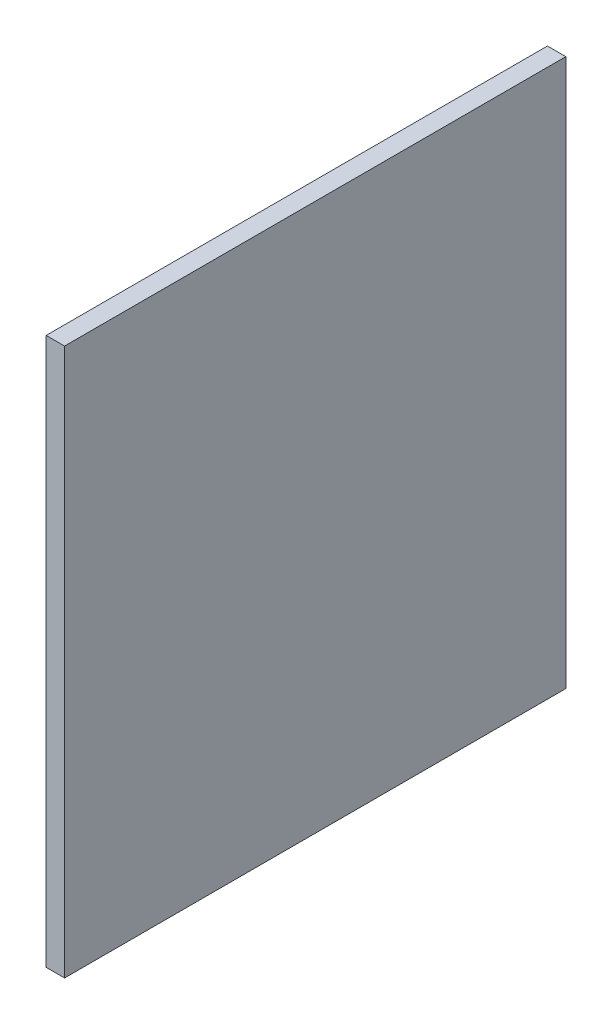
ISO-10303-21;
HEADER;
FILE_DESCRIPTION(('STEP AP214'),'2;1');
FILE_NAME('part.step','',(''),(''),'','','');
FILE_SCHEMA(('AUTOMOTIVE_DESIGN { 1 0 10303 214 1 1 1 1 }'));
ENDSEC;
DATA;
#1=APPLICATION_CONTEXT('core data for automotive mechanical design processes');
#2=APPLICATION_PROTOCOL_DEFINITION('international standard','automotive_design',2000,#1);
#3=PRODUCT_CONTEXT('',#1,'mechanical');
#4=PRODUCT('Part','Part','',(#3));
#5=PRODUCT_RELATED_PRODUCT_CATEGORY('part','',(#4));
#6=PRODUCT_DEFINITION_FORMATION('','',#4);
#7=PRODUCT_DEFINITION_CONTEXT('part definition',#1,'design');
#8=PRODUCT_DEFINITION('design','',#6,#7);
#9=PRODUCT_DEFINITION_SHAPE('','',#8);
#10=(LENGTH_UNIT() NAMED_UNIT(*) SI_UNIT(.MILLI.,.METRE.));
#11=(NAMED_UNIT(*) PLANE_ANGLE_UNIT() SI_UNIT($,.RADIAN.));
#12=(NAMED_UNIT(*) SI_UNIT($,.STERADIAN.) SOLID_ANGLE_UNIT());
#13=UNCERTAINTY_MEASURE_WITH_UNIT(LENGTH_MEASURE(1.E-05),#10,'distance_accuracy_value','');
#14=(GEOMETRIC_REPRESENTATION_CONTEXT(3) GLOBAL_UNCERTAINTY_ASSIGNED_CONTEXT((#13)) GLOBAL_UNIT_ASSIGNED_CONTEXT((#10,
#11,#12)) REPRESENTATION_CONTEXT('',''));
#15=CARTESIAN_POINT('',(0.,0.,0.));
#16=DIRECTION('',(0.,0.,1.));
#17=DIRECTION('',(1.,0.,0.));
#18=AXIS2_PLACEMENT_3D('',#15,#16,#17);
#19=CARTESIAN_POINT('',(18.,0.,0.));
#20=DIRECTION('',(0.,0.,-1.));
#21=DIRECTION('',(-1.,0.,0.));
#22=AXIS2_PLACEMENT_3D('',#19,#20,#21);
#23=PLANE('',#22);
#24=DIRECTION('',(0.,-1.,0.));
#25=VECTOR('',#24,1.);
#26=CARTESIAN_POINT('',(0.,0.,0.));
#27=LINE('',#26,#25);
#28=CARTESIAN_POINT('',(0.,535.,0.));
#29=VERTEX_POINT('',#28);
#30=CARTESIAN_POINT('',(0.,0.,0.));
#31=VERTEX_POINT('',#30);
#32=EDGE_CURVE('E96',#29,#31,#27,.T.);
#33=ORIENTED_EDGE('',*,*,#32,.T.);
#34=DIRECTION('',(-1.,0.,0.));
#35=VECTOR('',#34,1.);
#36=CARTESIAN_POINT('',(18.,0.,0.));
#37=LINE('',#36,#35);
#38=CARTESIAN_POINT('',(18.,0.,0.));
#39=VERTEX_POINT('',#38);
#40=EDGE_CURVE('E11',#39,#31,#37,.T.);
#41=ORIENTED_EDGE('',*,*,#40,.F.);
#42=DIRECTION('',(0.,-1.,0.));
#43=VECTOR('',#42,1.);
#44=CARTESIAN_POINT('',(18.,0.,0.));
#45=LINE('',#44,#43);
#46=CARTESIAN_POINT('',(18.,535.,0.));
#47=VERTEX_POINT('',#46);
#48=EDGE_CURVE('E84',#47,#39,#45,.T.);
#49=ORIENTED_EDGE('',*,*,#48,.F.);
#50=DIRECTION('',(-1.,0.,0.));
#51=VECTOR('',#50,1.);
#52=CARTESIAN_POINT('',(18.,535.,0.));
#53=LINE('',#52,#51);
#54=EDGE_CURVE('E92',#47,#29,#53,.T.);
#55=ORIENTED_EDGE('',*,*,#54,.T.);
#56=EDGE_LOOP('',(#33,#41,#49,#55));
#57=FACE_BOUND('',#56,.T.);
#58=ADVANCED_FACE('F33',(#57),#23,.F.);
#59=CARTESIAN_POINT('',(18.,0.,0.));
#60=DIRECTION('',(0.,1.,0.));
#61=DIRECTION('',(0.,0.,1.));
#62=AXIS2_PLACEMENT_3D('',#59,#60,#61);
#63=PLANE('',#62);
#64=DIRECTION('',(0.,0.,-1.));
#65=VECTOR('',#64,1.);
#66=CARTESIAN_POINT('',(0.,0.,0.));
#67=LINE('',#66,#65);
#68=CARTESIAN_POINT('',(0.,0.,-490.));
#69=VERTEX_POINT('',#68);
#70=EDGE_CURVE('E88',#31,#69,#67,.T.);
#71=ORIENTED_EDGE('',*,*,#70,.T.);
#72=DIRECTION('',(-1.,0.,0.));
#73=VECTOR('',#72,1.);
#74=CARTESIAN_POINT('',(18.,0.,-490.));
#75=LINE('',#74,#73);
#76=CARTESIAN_POINT('',(18.,0.,-490.));
#77=VERTEX_POINT('',#76);
#78=EDGE_CURVE('E41',#77,#69,#75,.T.);
#79=ORIENTED_EDGE('',*,*,#78,.F.);
#80=DIRECTION('',(0.,0.,-1.));
#81=VECTOR('',#80,1.);
#82=CARTESIAN_POINT('',(18.,0.,0.));
#83=LINE('',#82,#81);
#84=EDGE_CURVE('E79',#39,#77,#83,.T.);
#85=ORIENTED_EDGE('',*,*,#84,.F.);
#86=ORIENTED_EDGE('',*,*,#40,.T.);
#87=EDGE_LOOP('',(#71,#79,#85,#86));
#88=FACE_BOUND('',#87,.T.);
#89=ADVANCED_FACE('F87',(#88),#63,.F.);
#90=CARTESIAN_POINT('',(18.,0.,-490.));
#91=DIRECTION('',(0.,0.,1.));
#92=DIRECTION('',(1.,0.,0.));
#93=AXIS2_PLACEMENT_3D('',#90,#91,#92);
#94=PLANE('',#93);
#95=DIRECTION('',(0.,1.,0.));
#96=VECTOR('',#95,1.);
#97=CARTESIAN_POINT('',(0.,0.,-490.));
#98=LINE('',#97,#96);
#99=CARTESIAN_POINT('',(0.,535.,-490.));
#100=VERTEX_POINT('',#99);
#101=EDGE_CURVE('E66',#69,#100,#98,.T.);
#102=ORIENTED_EDGE('',*,*,#101,.T.);
#103=DIRECTION('',(-1.,0.,0.));
#104=VECTOR('',#103,1.);
#105=CARTESIAN_POINT('',(18.,535.,-490.));
#106=LINE('',#105,#104);
#107=CARTESIAN_POINT('',(18.,535.,-490.));
#108=VERTEX_POINT('',#107);
#109=EDGE_CURVE('E89',#108,#100,#106,.T.);
#110=ORIENTED_EDGE('',*,*,#109,.F.);
#111=DIRECTION('',(0.,1.,0.));
#112=VECTOR('',#111,1.);
#113=CARTESIAN_POINT('',(18.,0.,-490.));
#114=LINE('',#113,#112);
#115=EDGE_CURVE('E82',#77,#108,#114,.T.);
#116=ORIENTED_EDGE('',*,*,#115,.F.);
#117=ORIENTED_EDGE('',*,*,#78,.T.);
#118=EDGE_LOOP('',(#102,#110,#116,#117));
#119=FACE_BOUND('',#118,.T.);
#120=ADVANCED_FACE('F90',(#119),#94,.F.);
#121=CARTESIAN_POINT('',(18.,535.,0.));
#122=DIRECTION('',(0.,-1.,0.));
#123=DIRECTION('',(0.,0.,-1.));
#124=AXIS2_PLACEMENT_3D('',#121,#122,#123);
#125=PLANE('',#124);
#126=DIRECTION('',(0.,0.,1.));
#127=VECTOR('',#126,1.);
#128=CARTESIAN_POINT('',(0.,535.,0.));
#129=LINE('',#128,#127);
#130=EDGE_CURVE('E72',#100,#29,#129,.T.);
#131=ORIENTED_EDGE('',*,*,#130,.T.);
#132=ORIENTED_EDGE('',*,*,#54,.F.);
#133=DIRECTION('',(0.,0.,1.));
#134=VECTOR('',#133,1.);
#135=CARTESIAN_POINT('',(18.,535.,0.));
#136=LINE('',#135,#134);
#137=EDGE_CURVE('E49',#108,#47,#136,.T.);
#138=ORIENTED_EDGE('',*,*,#137,.F.);
#139=ORIENTED_EDGE('',*,*,#109,.T.);
#140=EDGE_LOOP('',(#131,#132,#138,#139));
#141=FACE_BOUND('',#140,.T.);
#142=ADVANCED_FACE('F103',(#141),#125,.F.);
#143=CARTESIAN_POINT('',(18.,0.,0.));
#144=DIRECTION('',(-1.,0.,0.));
#145=DIRECTION('',(0.,0.,1.));
#146=AXIS2_PLACEMENT_3D('',#143,#144,#145);
#147=PLANE('',#146);
#148=ORIENTED_EDGE('',*,*,#48,.T.);
#149=ORIENTED_EDGE('',*,*,#84,.T.);
#150=ORIENTED_EDGE('',*,*,#115,.T.);
#151=ORIENTED_EDGE('',*,*,#137,.T.);
#152=EDGE_LOOP('',(#148,#149,#150,#151));
#153=FACE_BOUND('',#152,.T.);
#154=ADVANCED_FACE('F80',(#153),#147,.F.);
#155=CARTESIAN_POINT('',(0.,0.,0.));
#156=DIRECTION('',(-1.,0.,0.));
#157=DIRECTION('',(0.,0.,1.));
#158=AXIS2_PLACEMENT_3D('',#155,#156,#157);
#159=PLANE('',#158);
#160=ORIENTED_EDGE('',*,*,#32,.F.);
#161=ORIENTED_EDGE('',*,*,#130,.F.);
#162=ORIENTED_EDGE('',*,*,#101,.F.);
#163=ORIENTED_EDGE('',*,*,#70,.F.);
#164=EDGE_LOOP('',(#160,#161,#162,#163));
#165=FACE_BOUND('',#164,.T.);
#166=ADVANCED_FACE('F106',(#165),#159,.T.);
#167=CLOSED_SHELL('',(#58,#89,#120,#142,#154,#166));
#168=MANIFOLD_SOLID_BREP('B2',#167);
#169=ADVANCED_BREP_SHAPE_REPRESENTATION('',(#18,#168),#14);
#170=SHAPE_DEFINITION_REPRESENTATION(#9,#169);
ENDSEC;
END-ISO-10303-21;
